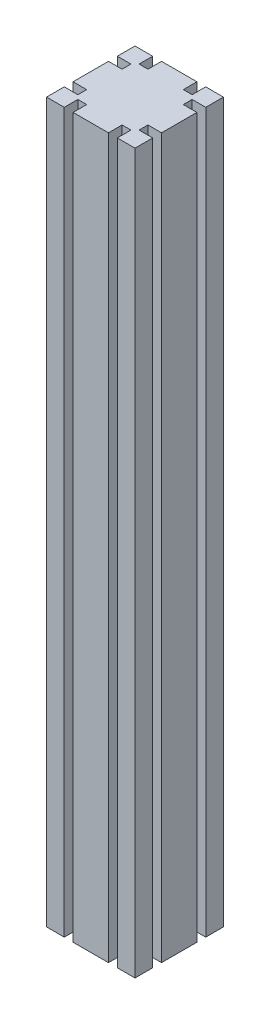
ISO-10303-21;
HEADER;
FILE_DESCRIPTION(('STEP AP214'),'2;1');
FILE_NAME('part.step','',(''),(''),'','','');
FILE_SCHEMA(('AUTOMOTIVE_DESIGN { 1 0 10303 214 1 1 1 1 }'));
ENDSEC;
DATA;
#1=APPLICATION_CONTEXT('core data for automotive mechanical design processes');
#2=APPLICATION_PROTOCOL_DEFINITION('international standard','automotive_design',2000,#1);
#3=PRODUCT_CONTEXT('',#1,'mechanical');
#4=PRODUCT('Part','Part','',(#3));
#5=PRODUCT_RELATED_PRODUCT_CATEGORY('part','',(#4));
#6=PRODUCT_DEFINITION_FORMATION('','',#4);
#7=PRODUCT_DEFINITION_CONTEXT('part definition',#1,'design');
#8=PRODUCT_DEFINITION('design','',#6,#7);
#9=PRODUCT_DEFINITION_SHAPE('','',#8);
#10=(LENGTH_UNIT() NAMED_UNIT(*) SI_UNIT(.MILLI.,.METRE.));
#11=(NAMED_UNIT(*) PLANE_ANGLE_UNIT() SI_UNIT($,.RADIAN.));
#12=(NAMED_UNIT(*) SI_UNIT($,.STERADIAN.) SOLID_ANGLE_UNIT());
#13=UNCERTAINTY_MEASURE_WITH_UNIT(LENGTH_MEASURE(1.E-05),#10,'distance_accuracy_value','');
#14=(GEOMETRIC_REPRESENTATION_CONTEXT(3) GLOBAL_UNCERTAINTY_ASSIGNED_CONTEXT((#13)) GLOBAL_UNIT_ASSIGNED_CONTEXT((#10,
#11,#12)) REPRESENTATION_CONTEXT('',''));
#15=CARTESIAN_POINT('',(0.,0.,0.));
#16=DIRECTION('',(0.,0.,1.));
#17=DIRECTION('',(1.,0.,0.));
#18=AXIS2_PLACEMENT_3D('',#15,#16,#17);
#19=CARTESIAN_POINT('',(-7.3207793932152,650.,0.));
#20=DIRECTION('',(-1.,0.,0.));
#21=DIRECTION('',(0.,0.,1.));
#22=AXIS2_PLACEMENT_3D('',#19,#20,#21);
#23=PLANE('',#22);
#24=DIRECTION('',(0.,0.,-1.));
#25=VECTOR('',#24,1.);
#26=CARTESIAN_POINT('',(-7.3207793932152,0.,0.));
#27=LINE('',#26,#25);
#28=CARTESIAN_POINT('',(-7.3207793932152,0.,-34.4799898452136));
#29=VERTEX_POINT('',#28);
#30=CARTESIAN_POINT('',(-7.3207793932152,0.,-50.4799898452136));
#31=VERTEX_POINT('',#30);
#32=EDGE_CURVE('E299',#29,#31,#27,.T.);
#33=ORIENTED_EDGE('',*,*,#32,.F.);
#34=DIRECTION('',(0.,-1.,0.));
#35=VECTOR('',#34,1.);
#36=CARTESIAN_POINT('',(-7.3207793932152,650.,-34.4799898452136));
#37=LINE('',#36,#35);
#38=CARTESIAN_POINT('',(-7.3207793932152,650.,-34.4799898452136));
#39=VERTEX_POINT('',#38);
#40=EDGE_CURVE('E11',#39,#29,#37,.T.);
#41=ORIENTED_EDGE('',*,*,#40,.F.);
#42=DIRECTION('',(0.,0.,-1.));
#43=VECTOR('',#42,1.);
#44=CARTESIAN_POINT('',(-7.3207793932152,650.,0.));
#45=LINE('',#44,#43);
#46=CARTESIAN_POINT('',(-7.3207793932152,650.,-50.4799898452136));
#47=VERTEX_POINT('',#46);
#48=EDGE_CURVE('E403',#39,#47,#45,.T.);
#49=ORIENTED_EDGE('',*,*,#48,.T.);
#50=DIRECTION('',(0.,-1.,0.));
#51=VECTOR('',#50,1.);
#52=CARTESIAN_POINT('',(-7.3207793932152,650.,-50.4799898452136));
#53=LINE('',#52,#51);
#54=EDGE_CURVE('E54',#47,#31,#53,.T.);
#55=ORIENTED_EDGE('',*,*,#54,.T.);
#56=EDGE_LOOP('',(#33,#41,#49,#55));
#57=FACE_BOUND('',#56,.T.);
#58=ADVANCED_FACE('F38',(#57),#23,.T.);
#59=CARTESIAN_POINT('',(0.,650.,-34.4799898452136));
#60=DIRECTION('',(0.,0.,1.));
#61=DIRECTION('',(1.,0.,0.));
#62=AXIS2_PLACEMENT_3D('',#59,#60,#61);
#63=PLANE('',#62);
#64=DIRECTION('',(-1.,0.,0.));
#65=VECTOR('',#64,1.);
#66=CARTESIAN_POINT('',(0.,0.,-34.4799898452136));
#67=LINE('',#66,#65);
#68=CARTESIAN_POINT('',(4.9792206067848,0.,-34.4799898452136));
#69=VERTEX_POINT('',#68);
#70=EDGE_CURVE('E301',#69,#29,#67,.T.);
#71=ORIENTED_EDGE('',*,*,#70,.F.);
#72=DIRECTION('',(0.,-1.,0.));
#73=VECTOR('',#72,1.);
#74=CARTESIAN_POINT('',(4.9792206067848,650.,-34.4799898452136));
#75=LINE('',#74,#73);
#76=CARTESIAN_POINT('',(4.9792206067848,650.,-34.4799898452136));
#77=VERTEX_POINT('',#76);
#78=EDGE_CURVE('E46',#77,#69,#75,.T.);
#79=ORIENTED_EDGE('',*,*,#78,.F.);
#80=DIRECTION('',(-1.,0.,0.));
#81=VECTOR('',#80,1.);
#82=CARTESIAN_POINT('',(0.,650.,-34.4799898452136));
#83=LINE('',#82,#81);
#84=EDGE_CURVE('E488',#77,#39,#83,.T.);
#85=ORIENTED_EDGE('',*,*,#84,.T.);
#86=ORIENTED_EDGE('',*,*,#40,.T.);
#87=EDGE_LOOP('',(#71,#79,#85,#86));
#88=FACE_BOUND('',#87,.T.);
#89=ADVANCED_FACE('F476',(#88),#63,.T.);
#90=CARTESIAN_POINT('',(4.9792206067848,650.,0.));
#91=DIRECTION('',(-1.,0.,0.));
#92=DIRECTION('',(0.,0.,1.));
#93=AXIS2_PLACEMENT_3D('',#90,#91,#92);
#94=PLANE('',#93);
#95=DIRECTION('',(0.,0.,-1.));
#96=VECTOR('',#95,1.);
#97=CARTESIAN_POINT('',(4.9792206067848,0.,0.));
#98=LINE('',#97,#96);
#99=CARTESIAN_POINT('',(4.9792206067848,0.,-26.4799898452136));
#100=VERTEX_POINT('',#99);
#101=EDGE_CURVE('E304',#100,#69,#98,.T.);
#102=ORIENTED_EDGE('',*,*,#101,.F.);
#103=DIRECTION('',(0.,-1.,0.));
#104=VECTOR('',#103,1.);
#105=CARTESIAN_POINT('',(4.9792206067848,650.,-26.4799898452136));
#106=LINE('',#105,#104);
#107=CARTESIAN_POINT('',(4.9792206067848,650.,-26.4799898452136));
#108=VERTEX_POINT('',#107);
#109=EDGE_CURVE('E465',#108,#100,#106,.T.);
#110=ORIENTED_EDGE('',*,*,#109,.F.);
#111=DIRECTION('',(0.,0.,-1.));
#112=VECTOR('',#111,1.);
#113=CARTESIAN_POINT('',(4.9792206067848,650.,0.));
#114=LINE('',#113,#112);
#115=EDGE_CURVE('E472',#108,#77,#114,.T.);
#116=ORIENTED_EDGE('',*,*,#115,.T.);
#117=ORIENTED_EDGE('',*,*,#78,.T.);
#118=EDGE_LOOP('',(#102,#110,#116,#117));
#119=FACE_BOUND('',#118,.T.);
#120=ADVANCED_FACE('F470',(#119),#94,.T.);
#121=CARTESIAN_POINT('',(0.,650.,-26.4799898452136));
#122=DIRECTION('',(0.,0.,-1.));
#123=DIRECTION('',(-1.,0.,0.));
#124=AXIS2_PLACEMENT_3D('',#121,#122,#123);
#125=PLANE('',#124);
#126=DIRECTION('',(1.,0.,0.));
#127=VECTOR('',#126,1.);
#128=CARTESIAN_POINT('',(0.,0.,-26.4799898452136));
#129=LINE('',#128,#127);
#130=CARTESIAN_POINT('',(-7.3207793932152,0.,-26.4799898452136));
#131=VERTEX_POINT('',#130);
#132=EDGE_CURVE('E307',#131,#100,#129,.T.);
#133=ORIENTED_EDGE('',*,*,#132,.F.);
#134=DIRECTION('',(0.,-1.,0.));
#135=VECTOR('',#134,1.);
#136=CARTESIAN_POINT('',(-7.3207793932152,650.,-26.4799898452136));
#137=LINE('',#136,#135);
#138=CARTESIAN_POINT('',(-7.3207793932152,650.,-26.4799898452136));
#139=VERTEX_POINT('',#138);
#140=EDGE_CURVE('E463',#139,#131,#137,.T.);
#141=ORIENTED_EDGE('',*,*,#140,.F.);
#142=DIRECTION('',(1.,0.,0.));
#143=VECTOR('',#142,1.);
#144=CARTESIAN_POINT('',(0.,650.,-26.4799898452136));
#145=LINE('',#144,#143);
#146=EDGE_CURVE('E485',#139,#108,#145,.T.);
#147=ORIENTED_EDGE('',*,*,#146,.T.);
#148=ORIENTED_EDGE('',*,*,#109,.T.);
#149=EDGE_LOOP('',(#133,#141,#147,#148));
#150=FACE_BOUND('',#149,.T.);
#151=ADVANCED_FACE('F482',(#150),#125,.T.);
#152=CARTESIAN_POINT('',(-7.3207793932152,650.,0.));
#153=DIRECTION('',(-1.,0.,0.));
#154=DIRECTION('',(0.,0.,1.));
#155=AXIS2_PLACEMENT_3D('',#152,#153,#154);
#156=PLANE('',#155);
#157=DIRECTION('',(0.,0.,-1.));
#158=VECTOR('',#157,1.);
#159=CARTESIAN_POINT('',(-7.3207793932152,0.,0.));
#160=LINE('',#159,#158);
#161=CARTESIAN_POINT('',(-7.3207793932152,0.,5.52001015478639));
#162=VERTEX_POINT('',#161);
#163=EDGE_CURVE('E310',#162,#131,#160,.T.);
#164=ORIENTED_EDGE('',*,*,#163,.F.);
#165=DIRECTION('',(0.,-1.,0.));
#166=VECTOR('',#165,1.);
#167=CARTESIAN_POINT('',(-7.3207793932152,650.,5.52001015478639));
#168=LINE('',#167,#166);
#169=CARTESIAN_POINT('',(-7.3207793932152,650.,5.52001015478639));
#170=VERTEX_POINT('',#169);
#171=EDGE_CURVE('E461',#170,#162,#168,.T.);
#172=ORIENTED_EDGE('',*,*,#171,.F.);
#173=DIRECTION('',(0.,0.,-1.));
#174=VECTOR('',#173,1.);
#175=CARTESIAN_POINT('',(-7.3207793932152,650.,0.));
#176=LINE('',#175,#174);
#177=EDGE_CURVE('E490',#170,#139,#176,.T.);
#178=ORIENTED_EDGE('',*,*,#177,.T.);
#179=ORIENTED_EDGE('',*,*,#140,.T.);
#180=EDGE_LOOP('',(#164,#172,#178,#179));
#181=FACE_BOUND('',#180,.T.);
#182=ADVANCED_FACE('F601',(#181),#156,.T.);
#183=CARTESIAN_POINT('',(0.,650.,5.52001015478639));
#184=DIRECTION('',(0.,0.,1.));
#185=DIRECTION('',(1.,0.,0.));
#186=AXIS2_PLACEMENT_3D('',#183,#184,#185);
#187=PLANE('',#186);
#188=DIRECTION('',(-1.,0.,0.));
#189=VECTOR('',#188,1.);
#190=CARTESIAN_POINT('',(0.,0.,5.52001015478639));
#191=LINE('',#190,#189);
#192=CARTESIAN_POINT('',(4.9792206067848,0.,5.52001015478639));
#193=VERTEX_POINT('',#192);
#194=EDGE_CURVE('E313',#193,#162,#191,.T.);
#195=ORIENTED_EDGE('',*,*,#194,.F.);
#196=DIRECTION('',(0.,-1.,0.));
#197=VECTOR('',#196,1.);
#198=CARTESIAN_POINT('',(4.9792206067848,650.,5.52001015478639));
#199=LINE('',#198,#197);
#200=CARTESIAN_POINT('',(4.9792206067848,650.,5.52001015478639));
#201=VERTEX_POINT('',#200);
#202=EDGE_CURVE('E459',#201,#193,#199,.T.);
#203=ORIENTED_EDGE('',*,*,#202,.F.);
#204=DIRECTION('',(-1.,0.,0.));
#205=VECTOR('',#204,1.);
#206=CARTESIAN_POINT('',(0.,650.,5.52001015478639));
#207=LINE('',#206,#205);
#208=EDGE_CURVE('E496',#201,#170,#207,.T.);
#209=ORIENTED_EDGE('',*,*,#208,.T.);
#210=ORIENTED_EDGE('',*,*,#171,.T.);
#211=EDGE_LOOP('',(#195,#203,#209,#210));
#212=FACE_BOUND('',#211,.T.);
#213=ADVANCED_FACE('F604',(#212),#187,.T.);
#214=CARTESIAN_POINT('',(4.9792206067848,650.,0.));
#215=DIRECTION('',(-1.,0.,0.));
#216=DIRECTION('',(0.,0.,1.));
#217=AXIS2_PLACEMENT_3D('',#214,#215,#216);
#218=PLANE('',#217);
#219=DIRECTION('',(0.,0.,-1.));
#220=VECTOR('',#219,1.);
#221=CARTESIAN_POINT('',(4.9792206067848,0.,0.));
#222=LINE('',#221,#220);
#223=CARTESIAN_POINT('',(4.9792206067848,0.,13.5200101547863));
#224=VERTEX_POINT('',#223);
#225=EDGE_CURVE('E316',#224,#193,#222,.T.);
#226=ORIENTED_EDGE('',*,*,#225,.F.);
#227=DIRECTION('',(0.,-1.,0.));
#228=VECTOR('',#227,1.);
#229=CARTESIAN_POINT('',(4.9792206067848,650.,13.5200101547863));
#230=LINE('',#229,#228);
#231=CARTESIAN_POINT('',(4.9792206067848,650.,13.5200101547863));
#232=VERTEX_POINT('',#231);
#233=EDGE_CURVE('E457',#232,#224,#230,.T.);
#234=ORIENTED_EDGE('',*,*,#233,.F.);
#235=DIRECTION('',(0.,0.,-1.));
#236=VECTOR('',#235,1.);
#237=CARTESIAN_POINT('',(4.9792206067848,650.,0.));
#238=LINE('',#237,#236);
#239=EDGE_CURVE('E499',#232,#201,#238,.T.);
#240=ORIENTED_EDGE('',*,*,#239,.T.);
#241=ORIENTED_EDGE('',*,*,#202,.T.);
#242=EDGE_LOOP('',(#226,#234,#240,#241));
#243=FACE_BOUND('',#242,.T.);
#244=ADVANCED_FACE('F608',(#243),#218,.T.);
#245=CARTESIAN_POINT('',(0.,650.,13.5200101547863));
#246=DIRECTION('',(0.,0.,-1.));
#247=DIRECTION('',(-1.,0.,0.));
#248=AXIS2_PLACEMENT_3D('',#245,#246,#247);
#249=PLANE('',#248);
#250=DIRECTION('',(1.,0.,0.));
#251=VECTOR('',#250,1.);
#252=CARTESIAN_POINT('',(0.,0.,13.5200101547863));
#253=LINE('',#252,#251);
#254=CARTESIAN_POINT('',(-7.32077939321523,0.,13.5200101547863));
#255=VERTEX_POINT('',#254);
#256=EDGE_CURVE('E319',#255,#224,#253,.T.);
#257=ORIENTED_EDGE('',*,*,#256,.F.);
#258=DIRECTION('',(0.,-1.,0.));
#259=VECTOR('',#258,1.);
#260=CARTESIAN_POINT('',(-7.32077939321523,650.,13.5200101547863));
#261=LINE('',#260,#259);
#262=CARTESIAN_POINT('',(-7.32077939321523,650.,13.5200101547863));
#263=VERTEX_POINT('',#262);
#264=EDGE_CURVE('E455',#263,#255,#261,.T.);
#265=ORIENTED_EDGE('',*,*,#264,.F.);
#266=DIRECTION('',(1.,0.,0.));
#267=VECTOR('',#266,1.);
#268=CARTESIAN_POINT('',(0.,650.,13.5200101547863));
#269=LINE('',#268,#267);
#270=EDGE_CURVE('E502',#263,#232,#269,.T.);
#271=ORIENTED_EDGE('',*,*,#270,.T.);
#272=ORIENTED_EDGE('',*,*,#233,.T.);
#273=EDGE_LOOP('',(#257,#265,#271,#272));
#274=FACE_BOUND('',#273,.T.);
#275=ADVANCED_FACE('F612',(#274),#249,.T.);
#276=CARTESIAN_POINT('',(-7.32077939321523,650.,0.));
#277=DIRECTION('',(-1.,0.,0.));
#278=DIRECTION('',(0.,0.,1.));
#279=AXIS2_PLACEMENT_3D('',#276,#277,#278);
#280=PLANE('',#279);
#281=DIRECTION('',(0.,0.,-1.));
#282=VECTOR('',#281,1.);
#283=CARTESIAN_POINT('',(-7.32077939321523,0.,0.));
#284=LINE('',#283,#282);
#285=CARTESIAN_POINT('',(-7.32077939321523,0.,29.5200101547863));
#286=VERTEX_POINT('',#285);
#287=EDGE_CURVE('E322',#286,#255,#284,.T.);
#288=ORIENTED_EDGE('',*,*,#287,.F.);
#289=DIRECTION('',(0.,-1.,0.));
#290=VECTOR('',#289,1.);
#291=CARTESIAN_POINT('',(-7.32077939321523,650.,29.5200101547863));
#292=LINE('',#291,#290);
#293=CARTESIAN_POINT('',(-7.32077939321523,650.,29.5200101547863));
#294=VERTEX_POINT('',#293);
#295=EDGE_CURVE('E453',#294,#286,#292,.T.);
#296=ORIENTED_EDGE('',*,*,#295,.F.);
#297=DIRECTION('',(0.,0.,-1.));
#298=VECTOR('',#297,1.);
#299=CARTESIAN_POINT('',(-7.32077939321523,650.,0.));
#300=LINE('',#299,#298);
#301=EDGE_CURVE('E505',#294,#263,#300,.T.);
#302=ORIENTED_EDGE('',*,*,#301,.T.);
#303=ORIENTED_EDGE('',*,*,#264,.T.);
#304=EDGE_LOOP('',(#288,#296,#302,#303));
#305=FACE_BOUND('',#304,.T.);
#306=ADVANCED_FACE('F616',(#305),#280,.T.);
#307=CARTESIAN_POINT('',(0.,650.,29.5200101547863));
#308=DIRECTION('',(0.,0.,1.));
#309=DIRECTION('',(1.,0.,0.));
#310=AXIS2_PLACEMENT_3D('',#307,#308,#309);
#311=PLANE('',#310);
#312=DIRECTION('',(-1.,0.,0.));
#313=VECTOR('',#312,1.);
#314=CARTESIAN_POINT('',(0.,0.,29.5200101547863));
#315=LINE('',#314,#313);
#316=CARTESIAN_POINT('',(8.67922060678477,0.,29.5200101547863));
#317=VERTEX_POINT('',#316);
#318=EDGE_CURVE('E325',#317,#286,#315,.T.);
#319=ORIENTED_EDGE('',*,*,#318,.F.);
#320=DIRECTION('',(0.,-1.,0.));
#321=VECTOR('',#320,1.);
#322=CARTESIAN_POINT('',(8.67922060678477,650.,29.5200101547863));
#323=LINE('',#322,#321);
#324=CARTESIAN_POINT('',(8.67922060678477,650.,29.5200101547863));
#325=VERTEX_POINT('',#324);
#326=EDGE_CURVE('E451',#325,#317,#323,.T.);
#327=ORIENTED_EDGE('',*,*,#326,.F.);
#328=DIRECTION('',(-1.,0.,0.));
#329=VECTOR('',#328,1.);
#330=CARTESIAN_POINT('',(0.,650.,29.5200101547863));
#331=LINE('',#330,#329);
#332=EDGE_CURVE('E508',#325,#294,#331,.T.);
#333=ORIENTED_EDGE('',*,*,#332,.T.);
#334=ORIENTED_EDGE('',*,*,#295,.T.);
#335=EDGE_LOOP('',(#319,#327,#333,#334));
#336=FACE_BOUND('',#335,.T.);
#337=ADVANCED_FACE('F620',(#336),#311,.T.);
#338=CARTESIAN_POINT('',(8.67922060678478,650.,0.));
#339=DIRECTION('',(1.,0.,0.));
#340=DIRECTION('',(0.,0.,-1.));
#341=AXIS2_PLACEMENT_3D('',#338,#339,#340);
#342=PLANE('',#341);
#343=DIRECTION('',(0.,0.,1.));
#344=VECTOR('',#343,1.);
#345=CARTESIAN_POINT('',(8.67922060678478,0.,0.));
#346=LINE('',#345,#344);
#347=CARTESIAN_POINT('',(8.67922060678478,0.,17.2200101547863));
#348=VERTEX_POINT('',#347);
#349=EDGE_CURVE('E328',#348,#317,#346,.T.);
#350=ORIENTED_EDGE('',*,*,#349,.F.);
#351=DIRECTION('',(0.,-1.,0.));
#352=VECTOR('',#351,1.);
#353=CARTESIAN_POINT('',(8.67922060678478,650.,17.2200101547863));
#354=LINE('',#353,#352);
#355=CARTESIAN_POINT('',(8.67922060678478,650.,17.2200101547863));
#356=VERTEX_POINT('',#355);
#357=EDGE_CURVE('E449',#356,#348,#354,.T.);
#358=ORIENTED_EDGE('',*,*,#357,.F.);
#359=DIRECTION('',(0.,0.,1.));
#360=VECTOR('',#359,1.);
#361=CARTESIAN_POINT('',(8.67922060678478,650.,0.));
#362=LINE('',#361,#360);
#363=EDGE_CURVE('E511',#356,#325,#362,.T.);
#364=ORIENTED_EDGE('',*,*,#363,.T.);
#365=ORIENTED_EDGE('',*,*,#326,.T.);
#366=EDGE_LOOP('',(#350,#358,#364,#365));
#367=FACE_BOUND('',#366,.T.);
#368=ADVANCED_FACE('F624',(#367),#342,.T.);
#369=CARTESIAN_POINT('',(0.,650.,17.2200101547863));
#370=DIRECTION('',(0.,0.,1.));
#371=DIRECTION('',(1.,0.,0.));
#372=AXIS2_PLACEMENT_3D('',#369,#370,#371);
#373=PLANE('',#372);
#374=DIRECTION('',(-1.,0.,0.));
#375=VECTOR('',#374,1.);
#376=CARTESIAN_POINT('',(0.,0.,17.2200101547863));
#377=LINE('',#376,#375);
#378=CARTESIAN_POINT('',(16.6792206067848,0.,17.2200101547863));
#379=VERTEX_POINT('',#378);
#380=EDGE_CURVE('E331',#379,#348,#377,.T.);
#381=ORIENTED_EDGE('',*,*,#380,.F.);
#382=DIRECTION('',(0.,-1.,0.));
#383=VECTOR('',#382,1.);
#384=CARTESIAN_POINT('',(16.6792206067848,650.,17.2200101547863));
#385=LINE('',#384,#383);
#386=CARTESIAN_POINT('',(16.6792206067848,650.,17.2200101547863));
#387=VERTEX_POINT('',#386);
#388=EDGE_CURVE('E447',#387,#379,#385,.T.);
#389=ORIENTED_EDGE('',*,*,#388,.F.);
#390=DIRECTION('',(-1.,0.,0.));
#391=VECTOR('',#390,1.);
#392=CARTESIAN_POINT('',(0.,650.,17.2200101547863));
#393=LINE('',#392,#391);
#394=EDGE_CURVE('E514',#387,#356,#393,.T.);
#395=ORIENTED_EDGE('',*,*,#394,.T.);
#396=ORIENTED_EDGE('',*,*,#357,.T.);
#397=EDGE_LOOP('',(#381,#389,#395,#396));
#398=FACE_BOUND('',#397,.T.);
#399=ADVANCED_FACE('F628',(#398),#373,.T.);
#400=CARTESIAN_POINT('',(16.6792206067848,650.,0.));
#401=DIRECTION('',(-1.,0.,0.));
#402=DIRECTION('',(0.,0.,1.));
#403=AXIS2_PLACEMENT_3D('',#400,#401,#402);
#404=PLANE('',#403);
#405=DIRECTION('',(0.,0.,-1.));
#406=VECTOR('',#405,1.);
#407=CARTESIAN_POINT('',(16.6792206067848,0.,0.));
#408=LINE('',#407,#406);
#409=CARTESIAN_POINT('',(16.6792206067848,0.,29.5200101547863));
#410=VERTEX_POINT('',#409);
#411=EDGE_CURVE('E334',#410,#379,#408,.T.);
#412=ORIENTED_EDGE('',*,*,#411,.F.);
#413=DIRECTION('',(0.,-1.,0.));
#414=VECTOR('',#413,1.);
#415=CARTESIAN_POINT('',(16.6792206067848,650.,29.5200101547863));
#416=LINE('',#415,#414);
#417=CARTESIAN_POINT('',(16.6792206067848,650.,29.5200101547863));
#418=VERTEX_POINT('',#417);
#419=EDGE_CURVE('E445',#418,#410,#416,.T.);
#420=ORIENTED_EDGE('',*,*,#419,.F.);
#421=DIRECTION('',(0.,0.,-1.));
#422=VECTOR('',#421,1.);
#423=CARTESIAN_POINT('',(16.6792206067848,650.,0.));
#424=LINE('',#423,#422);
#425=EDGE_CURVE('E517',#418,#387,#424,.T.);
#426=ORIENTED_EDGE('',*,*,#425,.T.);
#427=ORIENTED_EDGE('',*,*,#388,.T.);
#428=EDGE_LOOP('',(#412,#420,#426,#427));
#429=FACE_BOUND('',#428,.T.);
#430=ADVANCED_FACE('F632',(#429),#404,.T.);
#431=CARTESIAN_POINT('',(0.,650.,29.5200101547863));
#432=DIRECTION('',(0.,0.,1.));
#433=DIRECTION('',(1.,0.,0.));
#434=AXIS2_PLACEMENT_3D('',#431,#432,#433);
#435=PLANE('',#434);
#436=DIRECTION('',(-1.,0.,0.));
#437=VECTOR('',#436,1.);
#438=CARTESIAN_POINT('',(0.,0.,29.5200101547863));
#439=LINE('',#438,#437);
#440=CARTESIAN_POINT('',(48.6792206067848,0.,29.5200101547863));
#441=VERTEX_POINT('',#440);
#442=EDGE_CURVE('E337',#441,#410,#439,.T.);
#443=ORIENTED_EDGE('',*,*,#442,.F.);
#444=DIRECTION('',(0.,-1.,0.));
#445=VECTOR('',#444,1.);
#446=CARTESIAN_POINT('',(48.6792206067848,650.,29.5200101547863));
#447=LINE('',#446,#445);
#448=CARTESIAN_POINT('',(48.6792206067848,650.,29.5200101547863));
#449=VERTEX_POINT('',#448);
#450=EDGE_CURVE('E443',#449,#441,#447,.T.);
#451=ORIENTED_EDGE('',*,*,#450,.F.);
#452=DIRECTION('',(-1.,0.,0.));
#453=VECTOR('',#452,1.);
#454=CARTESIAN_POINT('',(0.,650.,29.5200101547863));
#455=LINE('',#454,#453);
#456=EDGE_CURVE('E520',#449,#418,#455,.T.);
#457=ORIENTED_EDGE('',*,*,#456,.T.);
#458=ORIENTED_EDGE('',*,*,#419,.T.);
#459=EDGE_LOOP('',(#443,#451,#457,#458));
#460=FACE_BOUND('',#459,.T.);
#461=ADVANCED_FACE('F636',(#460),#435,.T.);
#462=CARTESIAN_POINT('',(48.6792206067847,650.,-2.19694274546584E-13));
#463=DIRECTION('',(1.,0.,0.));
#464=DIRECTION('',(0.,0.,-1.));
#465=AXIS2_PLACEMENT_3D('',#462,#463,#464);
#466=PLANE('',#465);
#467=DIRECTION('',(0.,0.,1.));
#468=VECTOR('',#467,1.);
#469=CARTESIAN_POINT('',(48.6792206067847,0.,-2.19694274546584E-13));
#470=LINE('',#469,#468);
#471=CARTESIAN_POINT('',(48.6792206067848,0.,17.2200101547863));
#472=VERTEX_POINT('',#471);
#473=EDGE_CURVE('E340',#472,#441,#470,.T.);
#474=ORIENTED_EDGE('',*,*,#473,.F.);
#475=DIRECTION('',(0.,-1.,0.));
#476=VECTOR('',#475,1.);
#477=CARTESIAN_POINT('',(48.6792206067848,650.,17.2200101547863));
#478=LINE('',#477,#476);
#479=CARTESIAN_POINT('',(48.6792206067848,650.,17.2200101547863));
#480=VERTEX_POINT('',#479);
#481=EDGE_CURVE('E441',#480,#472,#478,.T.);
#482=ORIENTED_EDGE('',*,*,#481,.F.);
#483=DIRECTION('',(0.,0.,1.));
#484=VECTOR('',#483,1.);
#485=CARTESIAN_POINT('',(48.6792206067847,650.,-2.19694274546584E-13));
#486=LINE('',#485,#484);
#487=EDGE_CURVE('E523',#480,#449,#486,.T.);
#488=ORIENTED_EDGE('',*,*,#487,.T.);
#489=ORIENTED_EDGE('',*,*,#450,.T.);
#490=EDGE_LOOP('',(#474,#482,#488,#489));
#491=FACE_BOUND('',#490,.T.);
#492=ADVANCED_FACE('F640',(#491),#466,.T.);
#493=CARTESIAN_POINT('',(0.,650.,17.2200101547863));
#494=DIRECTION('',(0.,0.,1.));
#495=DIRECTION('',(1.,0.,0.));
#496=AXIS2_PLACEMENT_3D('',#493,#494,#495);
#497=PLANE('',#496);
#498=DIRECTION('',(-1.,0.,0.));
#499=VECTOR('',#498,1.);
#500=CARTESIAN_POINT('',(0.,0.,17.2200101547863));
#501=LINE('',#500,#499);
#502=CARTESIAN_POINT('',(56.6792206067848,0.,17.2200101547863));
#503=VERTEX_POINT('',#502);
#504=EDGE_CURVE('E343',#503,#472,#501,.T.);
#505=ORIENTED_EDGE('',*,*,#504,.F.);
#506=DIRECTION('',(0.,-1.,0.));
#507=VECTOR('',#506,1.);
#508=CARTESIAN_POINT('',(56.6792206067848,650.,17.2200101547863));
#509=LINE('',#508,#507);
#510=CARTESIAN_POINT('',(56.6792206067848,650.,17.2200101547863));
#511=VERTEX_POINT('',#510);
#512=EDGE_CURVE('E439',#511,#503,#509,.T.);
#513=ORIENTED_EDGE('',*,*,#512,.F.);
#514=DIRECTION('',(-1.,0.,0.));
#515=VECTOR('',#514,1.);
#516=CARTESIAN_POINT('',(0.,650.,17.2200101547863));
#517=LINE('',#516,#515);
#518=EDGE_CURVE('E526',#511,#480,#517,.T.);
#519=ORIENTED_EDGE('',*,*,#518,.T.);
#520=ORIENTED_EDGE('',*,*,#481,.T.);
#521=EDGE_LOOP('',(#505,#513,#519,#520));
#522=FACE_BOUND('',#521,.T.);
#523=ADVANCED_FACE('F644',(#522),#497,.T.);
#524=CARTESIAN_POINT('',(56.6792206067847,650.,-1.91849316266649E-13));
#525=DIRECTION('',(-1.,0.,0.));
#526=DIRECTION('',(0.,0.,1.));
#527=AXIS2_PLACEMENT_3D('',#524,#525,#526);
#528=PLANE('',#527);
#529=DIRECTION('',(0.,0.,-1.));
#530=VECTOR('',#529,1.);
#531=CARTESIAN_POINT('',(56.6792206067847,0.,-1.91849316266649E-13));
#532=LINE('',#531,#530);
#533=CARTESIAN_POINT('',(56.6792206067848,0.,29.5200101547863));
#534=VERTEX_POINT('',#533);
#535=EDGE_CURVE('E346',#534,#503,#532,.T.);
#536=ORIENTED_EDGE('',*,*,#535,.F.);
#537=DIRECTION('',(0.,-1.,0.));
#538=VECTOR('',#537,1.);
#539=CARTESIAN_POINT('',(56.6792206067848,650.,29.5200101547863));
#540=LINE('',#539,#538);
#541=CARTESIAN_POINT('',(56.6792206067848,650.,29.5200101547863));
#542=VERTEX_POINT('',#541);
#543=EDGE_CURVE('E437',#542,#534,#540,.T.);
#544=ORIENTED_EDGE('',*,*,#543,.F.);
#545=DIRECTION('',(0.,0.,-1.));
#546=VECTOR('',#545,1.);
#547=CARTESIAN_POINT('',(56.6792206067847,650.,-1.91849316266649E-13));
#548=LINE('',#547,#546);
#549=EDGE_CURVE('E529',#542,#511,#548,.T.);
#550=ORIENTED_EDGE('',*,*,#549,.T.);
#551=ORIENTED_EDGE('',*,*,#512,.T.);
#552=EDGE_LOOP('',(#536,#544,#550,#551));
#553=FACE_BOUND('',#552,.T.);
#554=ADVANCED_FACE('F648',(#553),#528,.T.);
#555=CARTESIAN_POINT('',(0.,650.,29.5200101547863));
#556=DIRECTION('',(0.,0.,1.));
#557=DIRECTION('',(1.,0.,0.));
#558=AXIS2_PLACEMENT_3D('',#555,#556,#557);
#559=PLANE('',#558);
#560=DIRECTION('',(-1.,0.,0.));
#561=VECTOR('',#560,1.);
#562=CARTESIAN_POINT('',(0.,0.,29.5200101547863));
#563=LINE('',#562,#561);
#564=CARTESIAN_POINT('',(72.6792206067848,0.,29.5200101547863));
#565=VERTEX_POINT('',#564);
#566=EDGE_CURVE('E349',#565,#534,#563,.T.);
#567=ORIENTED_EDGE('',*,*,#566,.F.);
#568=DIRECTION('',(0.,-1.,0.));
#569=VECTOR('',#568,1.);
#570=CARTESIAN_POINT('',(72.6792206067848,650.,29.5200101547863));
#571=LINE('',#570,#569);
#572=CARTESIAN_POINT('',(72.6792206067848,650.,29.5200101547863));
#573=VERTEX_POINT('',#572);
#574=EDGE_CURVE('E435',#573,#565,#571,.T.);
#575=ORIENTED_EDGE('',*,*,#574,.F.);
#576=DIRECTION('',(-1.,0.,0.));
#577=VECTOR('',#576,1.);
#578=CARTESIAN_POINT('',(0.,650.,29.5200101547863));
#579=LINE('',#578,#577);
#580=EDGE_CURVE('E532',#573,#542,#579,.T.);
#581=ORIENTED_EDGE('',*,*,#580,.T.);
#582=ORIENTED_EDGE('',*,*,#543,.T.);
#583=EDGE_LOOP('',(#567,#575,#581,#582));
#584=FACE_BOUND('',#583,.T.);
#585=ADVANCED_FACE('F652',(#584),#559,.T.);
#586=CARTESIAN_POINT('',(72.6792206067848,650.,0.));
#587=DIRECTION('',(1.,0.,0.));
#588=DIRECTION('',(0.,0.,-1.));
#589=AXIS2_PLACEMENT_3D('',#586,#587,#588);
#590=PLANE('',#589);
#591=DIRECTION('',(0.,0.,1.));
#592=VECTOR('',#591,1.);
#593=CARTESIAN_POINT('',(72.6792206067848,0.,0.));
#594=LINE('',#593,#592);
#595=CARTESIAN_POINT('',(72.6792206067848,0.,13.5200101547864));
#596=VERTEX_POINT('',#595);
#597=EDGE_CURVE('E352',#596,#565,#594,.T.);
#598=ORIENTED_EDGE('',*,*,#597,.F.);
#599=DIRECTION('',(0.,-1.,0.));
#600=VECTOR('',#599,1.);
#601=CARTESIAN_POINT('',(72.6792206067848,650.,13.5200101547864));
#602=LINE('',#601,#600);
#603=CARTESIAN_POINT('',(72.6792206067848,650.,13.5200101547864));
#604=VERTEX_POINT('',#603);
#605=EDGE_CURVE('E433',#604,#596,#602,.T.);
#606=ORIENTED_EDGE('',*,*,#605,.F.);
#607=DIRECTION('',(0.,0.,1.));
#608=VECTOR('',#607,1.);
#609=CARTESIAN_POINT('',(72.6792206067848,650.,0.));
#610=LINE('',#609,#608);
#611=EDGE_CURVE('E535',#604,#573,#610,.T.);
#612=ORIENTED_EDGE('',*,*,#611,.T.);
#613=ORIENTED_EDGE('',*,*,#574,.T.);
#614=EDGE_LOOP('',(#598,#606,#612,#613));
#615=FACE_BOUND('',#614,.T.);
#616=ADVANCED_FACE('F656',(#615),#590,.T.);
#617=CARTESIAN_POINT('',(0.,650.,13.5200101547864));
#618=DIRECTION('',(0.,0.,-1.));
#619=DIRECTION('',(-1.,0.,0.));
#620=AXIS2_PLACEMENT_3D('',#617,#618,#619);
#621=PLANE('',#620);
#622=DIRECTION('',(1.,0.,0.));
#623=VECTOR('',#622,1.);
#624=CARTESIAN_POINT('',(0.,0.,13.5200101547864));
#625=LINE('',#624,#623);
#626=CARTESIAN_POINT('',(60.3792206067848,0.,13.5200101547864));
#627=VERTEX_POINT('',#626);
#628=EDGE_CURVE('E355',#627,#596,#625,.T.);
#629=ORIENTED_EDGE('',*,*,#628,.F.);
#630=DIRECTION('',(0.,-1.,0.));
#631=VECTOR('',#630,1.);
#632=CARTESIAN_POINT('',(60.3792206067848,650.,13.5200101547864));
#633=LINE('',#632,#631);
#634=CARTESIAN_POINT('',(60.3792206067848,650.,13.5200101547864));
#635=VERTEX_POINT('',#634);
#636=EDGE_CURVE('E431',#635,#627,#633,.T.);
#637=ORIENTED_EDGE('',*,*,#636,.F.);
#638=DIRECTION('',(1.,0.,0.));
#639=VECTOR('',#638,1.);
#640=CARTESIAN_POINT('',(0.,650.,13.5200101547864));
#641=LINE('',#640,#639);
#642=EDGE_CURVE('E538',#635,#604,#641,.T.);
#643=ORIENTED_EDGE('',*,*,#642,.T.);
#644=ORIENTED_EDGE('',*,*,#605,.T.);
#645=EDGE_LOOP('',(#629,#637,#643,#644));
#646=FACE_BOUND('',#645,.T.);
#647=ADVANCED_FACE('F660',(#646),#621,.T.);
#648=CARTESIAN_POINT('',(60.3792206067848,650.,0.));
#649=DIRECTION('',(1.,0.,0.));
#650=DIRECTION('',(0.,0.,-1.));
#651=AXIS2_PLACEMENT_3D('',#648,#649,#650);
#652=PLANE('',#651);
#653=DIRECTION('',(0.,0.,1.));
#654=VECTOR('',#653,1.);
#655=CARTESIAN_POINT('',(60.3792206067848,0.,0.));
#656=LINE('',#655,#654);
#657=CARTESIAN_POINT('',(60.3792206067848,0.,5.5200101547864));
#658=VERTEX_POINT('',#657);
#659=EDGE_CURVE('E358',#658,#627,#656,.T.);
#660=ORIENTED_EDGE('',*,*,#659,.F.);
#661=DIRECTION('',(0.,-1.,0.));
#662=VECTOR('',#661,1.);
#663=CARTESIAN_POINT('',(60.3792206067848,650.,5.5200101547864));
#664=LINE('',#663,#662);
#665=CARTESIAN_POINT('',(60.3792206067848,650.,5.5200101547864));
#666=VERTEX_POINT('',#665);
#667=EDGE_CURVE('E429',#666,#658,#664,.T.);
#668=ORIENTED_EDGE('',*,*,#667,.F.);
#669=DIRECTION('',(0.,0.,1.));
#670=VECTOR('',#669,1.);
#671=CARTESIAN_POINT('',(60.3792206067848,650.,0.));
#672=LINE('',#671,#670);
#673=EDGE_CURVE('E541',#666,#635,#672,.T.);
#674=ORIENTED_EDGE('',*,*,#673,.T.);
#675=ORIENTED_EDGE('',*,*,#636,.T.);
#676=EDGE_LOOP('',(#660,#668,#674,#675));
#677=FACE_BOUND('',#676,.T.);
#678=ADVANCED_FACE('F664',(#677),#652,.T.);
#679=CARTESIAN_POINT('',(0.,650.,5.52001015478642));
#680=DIRECTION('',(0.,0.,1.));
#681=DIRECTION('',(1.,0.,0.));
#682=AXIS2_PLACEMENT_3D('',#679,#680,#681);
#683=PLANE('',#682);
#684=DIRECTION('',(-1.,0.,0.));
#685=VECTOR('',#684,1.);
#686=CARTESIAN_POINT('',(0.,0.,5.52001015478642));
#687=LINE('',#686,#685);
#688=CARTESIAN_POINT('',(72.6792206067848,0.,5.52001015478639));
#689=VERTEX_POINT('',#688);
#690=EDGE_CURVE('E361',#689,#658,#687,.T.);
#691=ORIENTED_EDGE('',*,*,#690,.F.);
#692=DIRECTION('',(0.,-1.,0.));
#693=VECTOR('',#692,1.);
#694=CARTESIAN_POINT('',(72.6792206067848,650.,5.52001015478639));
#695=LINE('',#694,#693);
#696=CARTESIAN_POINT('',(72.6792206067848,650.,5.52001015478639));
#697=VERTEX_POINT('',#696);
#698=EDGE_CURVE('E427',#697,#689,#695,.T.);
#699=ORIENTED_EDGE('',*,*,#698,.F.);
#700=DIRECTION('',(-1.,0.,0.));
#701=VECTOR('',#700,1.);
#702=CARTESIAN_POINT('',(0.,650.,5.52001015478642));
#703=LINE('',#702,#701);
#704=EDGE_CURVE('E544',#697,#666,#703,.T.);
#705=ORIENTED_EDGE('',*,*,#704,.T.);
#706=ORIENTED_EDGE('',*,*,#667,.T.);
#707=EDGE_LOOP('',(#691,#699,#705,#706));
#708=FACE_BOUND('',#707,.T.);
#709=ADVANCED_FACE('F668',(#708),#683,.T.);
#710=CARTESIAN_POINT('',(72.6792206067848,650.,0.));
#711=DIRECTION('',(1.,0.,0.));
#712=DIRECTION('',(0.,0.,-1.));
#713=AXIS2_PLACEMENT_3D('',#710,#711,#712);
#714=PLANE('',#713);
#715=DIRECTION('',(0.,0.,1.));
#716=VECTOR('',#715,1.);
#717=CARTESIAN_POINT('',(72.6792206067848,0.,0.));
#718=LINE('',#717,#716);
#719=CARTESIAN_POINT('',(72.6792206067848,0.,-26.4799898452136));
#720=VERTEX_POINT('',#719);
#721=EDGE_CURVE('E364',#720,#689,#718,.T.);
#722=ORIENTED_EDGE('',*,*,#721,.F.);
#723=DIRECTION('',(0.,-1.,0.));
#724=VECTOR('',#723,1.);
#725=CARTESIAN_POINT('',(72.6792206067848,650.,-26.4799898452136));
#726=LINE('',#725,#724);
#727=CARTESIAN_POINT('',(72.6792206067848,650.,-26.4799898452136));
#728=VERTEX_POINT('',#727);
#729=EDGE_CURVE('E425',#728,#720,#726,.T.);
#730=ORIENTED_EDGE('',*,*,#729,.F.);
#731=DIRECTION('',(0.,0.,1.));
#732=VECTOR('',#731,1.);
#733=CARTESIAN_POINT('',(72.6792206067848,650.,0.));
#734=LINE('',#733,#732);
#735=EDGE_CURVE('E547',#728,#697,#734,.T.);
#736=ORIENTED_EDGE('',*,*,#735,.T.);
#737=ORIENTED_EDGE('',*,*,#698,.T.);
#738=EDGE_LOOP('',(#722,#730,#736,#737));
#739=FACE_BOUND('',#738,.T.);
#740=ADVANCED_FACE('F672',(#739),#714,.T.);
#741=CARTESIAN_POINT('',(0.,650.,-26.4799898452136));
#742=DIRECTION('',(0.,0.,-1.));
#743=DIRECTION('',(-1.,0.,0.));
#744=AXIS2_PLACEMENT_3D('',#741,#742,#743);
#745=PLANE('',#744);
#746=DIRECTION('',(1.,0.,0.));
#747=VECTOR('',#746,1.);
#748=CARTESIAN_POINT('',(0.,0.,-26.4799898452136));
#749=LINE('',#748,#747);
#750=CARTESIAN_POINT('',(60.3792206067848,0.,-26.4799898452136));
#751=VERTEX_POINT('',#750);
#752=EDGE_CURVE('E367',#751,#720,#749,.T.);
#753=ORIENTED_EDGE('',*,*,#752,.F.);
#754=DIRECTION('',(0.,-1.,0.));
#755=VECTOR('',#754,1.);
#756=CARTESIAN_POINT('',(60.3792206067848,650.,-26.4799898452136));
#757=LINE('',#756,#755);
#758=CARTESIAN_POINT('',(60.3792206067848,650.,-26.4799898452136));
#759=VERTEX_POINT('',#758);
#760=EDGE_CURVE('E423',#759,#751,#757,.T.);
#761=ORIENTED_EDGE('',*,*,#760,.F.);
#762=DIRECTION('',(1.,0.,0.));
#763=VECTOR('',#762,1.);
#764=CARTESIAN_POINT('',(0.,650.,-26.4799898452136));
#765=LINE('',#764,#763);
#766=EDGE_CURVE('E550',#759,#728,#765,.T.);
#767=ORIENTED_EDGE('',*,*,#766,.T.);
#768=ORIENTED_EDGE('',*,*,#729,.T.);
#769=EDGE_LOOP('',(#753,#761,#767,#768));
#770=FACE_BOUND('',#769,.T.);
#771=ADVANCED_FACE('F676',(#770),#745,.T.);
#772=CARTESIAN_POINT('',(60.3792206067848,650.,0.));
#773=DIRECTION('',(1.,0.,0.));
#774=DIRECTION('',(0.,0.,-1.));
#775=AXIS2_PLACEMENT_3D('',#772,#773,#774);
#776=PLANE('',#775);
#777=DIRECTION('',(0.,0.,1.));
#778=VECTOR('',#777,1.);
#779=CARTESIAN_POINT('',(60.3792206067848,0.,0.));
#780=LINE('',#779,#778);
#781=CARTESIAN_POINT('',(60.3792206067848,0.,-34.4799898452136));
#782=VERTEX_POINT('',#781);
#783=EDGE_CURVE('E370',#782,#751,#780,.T.);
#784=ORIENTED_EDGE('',*,*,#783,.F.);
#785=DIRECTION('',(0.,-1.,0.));
#786=VECTOR('',#785,1.);
#787=CARTESIAN_POINT('',(60.3792206067848,650.,-34.4799898452136));
#788=LINE('',#787,#786);
#789=CARTESIAN_POINT('',(60.3792206067848,650.,-34.4799898452136));
#790=VERTEX_POINT('',#789);
#791=EDGE_CURVE('E421',#790,#782,#788,.T.);
#792=ORIENTED_EDGE('',*,*,#791,.F.);
#793=DIRECTION('',(0.,0.,1.));
#794=VECTOR('',#793,1.);
#795=CARTESIAN_POINT('',(60.3792206067848,650.,0.));
#796=LINE('',#795,#794);
#797=EDGE_CURVE('E553',#790,#759,#796,.T.);
#798=ORIENTED_EDGE('',*,*,#797,.T.);
#799=ORIENTED_EDGE('',*,*,#760,.T.);
#800=EDGE_LOOP('',(#784,#792,#798,#799));
#801=FACE_BOUND('',#800,.T.);
#802=ADVANCED_FACE('F680',(#801),#776,.T.);
#803=CARTESIAN_POINT('',(0.,650.,-34.4799898452136));
#804=DIRECTION('',(0.,0.,1.));
#805=DIRECTION('',(1.,0.,0.));
#806=AXIS2_PLACEMENT_3D('',#803,#804,#805);
#807=PLANE('',#806);
#808=DIRECTION('',(-1.,0.,0.));
#809=VECTOR('',#808,1.);
#810=CARTESIAN_POINT('',(0.,0.,-34.4799898452136));
#811=LINE('',#810,#809);
#812=CARTESIAN_POINT('',(72.6792206067848,0.,-34.4799898452136));
#813=VERTEX_POINT('',#812);
#814=EDGE_CURVE('E373',#813,#782,#811,.T.);
#815=ORIENTED_EDGE('',*,*,#814,.F.);
#816=DIRECTION('',(0.,-1.,0.));
#817=VECTOR('',#816,1.);
#818=CARTESIAN_POINT('',(72.6792206067848,650.,-34.4799898452136));
#819=LINE('',#818,#817);
#820=CARTESIAN_POINT('',(72.6792206067848,650.,-34.4799898452136));
#821=VERTEX_POINT('',#820);
#822=EDGE_CURVE('E419',#821,#813,#819,.T.);
#823=ORIENTED_EDGE('',*,*,#822,.F.);
#824=DIRECTION('',(-1.,0.,0.));
#825=VECTOR('',#824,1.);
#826=CARTESIAN_POINT('',(0.,650.,-34.4799898452136));
#827=LINE('',#826,#825);
#828=EDGE_CURVE('E556',#821,#790,#827,.T.);
#829=ORIENTED_EDGE('',*,*,#828,.T.);
#830=ORIENTED_EDGE('',*,*,#791,.T.);
#831=EDGE_LOOP('',(#815,#823,#829,#830));
#832=FACE_BOUND('',#831,.T.);
#833=ADVANCED_FACE('F684',(#832),#807,.T.);
#834=CARTESIAN_POINT('',(72.6792206067848,650.,0.));
#835=DIRECTION('',(1.,0.,0.));
#836=DIRECTION('',(0.,0.,-1.));
#837=AXIS2_PLACEMENT_3D('',#834,#835,#836);
#838=PLANE('',#837);
#839=DIRECTION('',(0.,0.,1.));
#840=VECTOR('',#839,1.);
#841=CARTESIAN_POINT('',(72.6792206067848,0.,0.));
#842=LINE('',#841,#840);
#843=CARTESIAN_POINT('',(72.6792206067848,0.,-50.4799898452136));
#844=VERTEX_POINT('',#843);
#845=EDGE_CURVE('E376',#844,#813,#842,.T.);
#846=ORIENTED_EDGE('',*,*,#845,.F.);
#847=DIRECTION('',(0.,-1.,0.));
#848=VECTOR('',#847,1.);
#849=CARTESIAN_POINT('',(72.6792206067848,650.,-50.4799898452136));
#850=LINE('',#849,#848);
#851=CARTESIAN_POINT('',(72.6792206067848,650.,-50.4799898452136));
#852=VERTEX_POINT('',#851);
#853=EDGE_CURVE('E417',#852,#844,#850,.T.);
#854=ORIENTED_EDGE('',*,*,#853,.F.);
#855=DIRECTION('',(0.,0.,1.));
#856=VECTOR('',#855,1.);
#857=CARTESIAN_POINT('',(72.6792206067848,650.,0.));
#858=LINE('',#857,#856);
#859=EDGE_CURVE('E559',#852,#821,#858,.T.);
#860=ORIENTED_EDGE('',*,*,#859,.T.);
#861=ORIENTED_EDGE('',*,*,#822,.T.);
#862=EDGE_LOOP('',(#846,#854,#860,#861));
#863=FACE_BOUND('',#862,.T.);
#864=ADVANCED_FACE('F688',(#863),#838,.T.);
#865=CARTESIAN_POINT('',(0.,650.,-50.4799898452137));
#866=DIRECTION('',(0.,0.,-1.));
#867=DIRECTION('',(-1.,0.,0.));
#868=AXIS2_PLACEMENT_3D('',#865,#866,#867);
#869=PLANE('',#868);
#870=DIRECTION('',(1.,0.,0.));
#871=VECTOR('',#870,1.);
#872=CARTESIAN_POINT('',(0.,0.,-50.4799898452137));
#873=LINE('',#872,#871);
#874=CARTESIAN_POINT('',(56.6792206067848,0.,-50.4799898452136));
#875=VERTEX_POINT('',#874);
#876=EDGE_CURVE('E379',#875,#844,#873,.T.);
#877=ORIENTED_EDGE('',*,*,#876,.F.);
#878=DIRECTION('',(0.,-1.,0.));
#879=VECTOR('',#878,1.);
#880=CARTESIAN_POINT('',(56.6792206067848,650.,-50.4799898452136));
#881=LINE('',#880,#879);
#882=CARTESIAN_POINT('',(56.6792206067848,650.,-50.4799898452136));
#883=VERTEX_POINT('',#882);
#884=EDGE_CURVE('E415',#883,#875,#881,.T.);
#885=ORIENTED_EDGE('',*,*,#884,.F.);
#886=DIRECTION('',(1.,0.,0.));
#887=VECTOR('',#886,1.);
#888=CARTESIAN_POINT('',(0.,650.,-50.4799898452137));
#889=LINE('',#888,#887);
#890=EDGE_CURVE('E562',#883,#852,#889,.T.);
#891=ORIENTED_EDGE('',*,*,#890,.T.);
#892=ORIENTED_EDGE('',*,*,#853,.T.);
#893=EDGE_LOOP('',(#877,#885,#891,#892));
#894=FACE_BOUND('',#893,.T.);
#895=ADVANCED_FACE('F692',(#894),#869,.T.);
#896=CARTESIAN_POINT('',(56.6792206067848,650.,0.));
#897=DIRECTION('',(-1.,0.,0.));
#898=DIRECTION('',(0.,0.,1.));
#899=AXIS2_PLACEMENT_3D('',#896,#897,#898);
#900=PLANE('',#899);
#901=DIRECTION('',(0.,0.,-1.));
#902=VECTOR('',#901,1.);
#903=CARTESIAN_POINT('',(56.6792206067848,0.,0.));
#904=LINE('',#903,#902);
#905=CARTESIAN_POINT('',(56.6792206067848,0.,-38.1799898452136));
#906=VERTEX_POINT('',#905);
#907=EDGE_CURVE('E382',#906,#875,#904,.T.);
#908=ORIENTED_EDGE('',*,*,#907,.F.);
#909=DIRECTION('',(0.,-1.,0.));
#910=VECTOR('',#909,1.);
#911=CARTESIAN_POINT('',(56.6792206067848,650.,-38.1799898452136));
#912=LINE('',#911,#910);
#913=CARTESIAN_POINT('',(56.6792206067848,650.,-38.1799898452136));
#914=VERTEX_POINT('',#913);
#915=EDGE_CURVE('E413',#914,#906,#912,.T.);
#916=ORIENTED_EDGE('',*,*,#915,.F.);
#917=DIRECTION('',(0.,0.,-1.));
#918=VECTOR('',#917,1.);
#919=CARTESIAN_POINT('',(56.6792206067848,650.,0.));
#920=LINE('',#919,#918);
#921=EDGE_CURVE('E565',#914,#883,#920,.T.);
#922=ORIENTED_EDGE('',*,*,#921,.T.);
#923=ORIENTED_EDGE('',*,*,#884,.T.);
#924=EDGE_LOOP('',(#908,#916,#922,#923));
#925=FACE_BOUND('',#924,.T.);
#926=ADVANCED_FACE('F696',(#925),#900,.T.);
#927=CARTESIAN_POINT('',(0.,650.,-38.1799898452136));
#928=DIRECTION('',(0.,0.,-1.));
#929=DIRECTION('',(-1.,0.,0.));
#930=AXIS2_PLACEMENT_3D('',#927,#928,#929);
#931=PLANE('',#930);
#932=DIRECTION('',(1.,0.,0.));
#933=VECTOR('',#932,1.);
#934=CARTESIAN_POINT('',(0.,0.,-38.1799898452136));
#935=LINE('',#934,#933);
#936=CARTESIAN_POINT('',(48.6792206067848,0.,-38.1799898452136));
#937=VERTEX_POINT('',#936);
#938=EDGE_CURVE('E385',#937,#906,#935,.T.);
#939=ORIENTED_EDGE('',*,*,#938,.F.);
#940=DIRECTION('',(0.,-1.,0.));
#941=VECTOR('',#940,1.);
#942=CARTESIAN_POINT('',(48.6792206067848,650.,-38.1799898452136));
#943=LINE('',#942,#941);
#944=CARTESIAN_POINT('',(48.6792206067848,650.,-38.1799898452136));
#945=VERTEX_POINT('',#944);
#946=EDGE_CURVE('E411',#945,#937,#943,.T.);
#947=ORIENTED_EDGE('',*,*,#946,.F.);
#948=DIRECTION('',(1.,0.,0.));
#949=VECTOR('',#948,1.);
#950=CARTESIAN_POINT('',(0.,650.,-38.1799898452136));
#951=LINE('',#950,#949);
#952=EDGE_CURVE('E568',#945,#914,#951,.T.);
#953=ORIENTED_EDGE('',*,*,#952,.T.);
#954=ORIENTED_EDGE('',*,*,#915,.T.);
#955=EDGE_LOOP('',(#939,#947,#953,#954));
#956=FACE_BOUND('',#955,.T.);
#957=ADVANCED_FACE('F700',(#956),#931,.T.);
#958=CARTESIAN_POINT('',(48.6792206067849,650.,0.));
#959=DIRECTION('',(1.,0.,0.));
#960=DIRECTION('',(0.,0.,-1.));
#961=AXIS2_PLACEMENT_3D('',#958,#959,#960);
#962=PLANE('',#961);
#963=DIRECTION('',(0.,0.,1.));
#964=VECTOR('',#963,1.);
#965=CARTESIAN_POINT('',(48.6792206067849,0.,0.));
#966=LINE('',#965,#964);
#967=CARTESIAN_POINT('',(48.6792206067848,0.,-50.4799898452136));
#968=VERTEX_POINT('',#967);
#969=EDGE_CURVE('E388',#968,#937,#966,.T.);
#970=ORIENTED_EDGE('',*,*,#969,.F.);
#971=DIRECTION('',(0.,-1.,0.));
#972=VECTOR('',#971,1.);
#973=CARTESIAN_POINT('',(48.6792206067848,650.,-50.4799898452136));
#974=LINE('',#973,#972);
#975=CARTESIAN_POINT('',(48.6792206067848,650.,-50.4799898452136));
#976=VERTEX_POINT('',#975);
#977=EDGE_CURVE('E409',#976,#968,#974,.T.);
#978=ORIENTED_EDGE('',*,*,#977,.F.);
#979=DIRECTION('',(0.,0.,1.));
#980=VECTOR('',#979,1.);
#981=CARTESIAN_POINT('',(48.6792206067849,650.,0.));
#982=LINE('',#981,#980);
#983=EDGE_CURVE('E571',#976,#945,#982,.T.);
#984=ORIENTED_EDGE('',*,*,#983,.T.);
#985=ORIENTED_EDGE('',*,*,#946,.T.);
#986=EDGE_LOOP('',(#970,#978,#984,#985));
#987=FACE_BOUND('',#986,.T.);
#988=ADVANCED_FACE('F704',(#987),#962,.T.);
#989=CARTESIAN_POINT('',(0.,650.,-50.4799898452136));
#990=DIRECTION('',(0.,0.,-1.));
#991=DIRECTION('',(-1.,0.,0.));
#992=AXIS2_PLACEMENT_3D('',#989,#990,#991);
#993=PLANE('',#992);
#994=DIRECTION('',(1.,0.,0.));
#995=VECTOR('',#994,1.);
#996=CARTESIAN_POINT('',(0.,0.,-50.4799898452136));
#997=LINE('',#996,#995);
#998=CARTESIAN_POINT('',(16.6792206067848,0.,-50.4799898452136));
#999=VERTEX_POINT('',#998);
#1000=EDGE_CURVE('E391',#999,#968,#997,.T.);
#1001=ORIENTED_EDGE('',*,*,#1000,.F.);
#1002=DIRECTION('',(0.,-1.,0.));
#1003=VECTOR('',#1002,1.);
#1004=CARTESIAN_POINT('',(16.6792206067848,650.,-50.4799898452136));
#1005=LINE('',#1004,#1003);
#1006=CARTESIAN_POINT('',(16.6792206067848,650.,-50.4799898452136));
#1007=VERTEX_POINT('',#1006);
#1008=EDGE_CURVE('E407',#1007,#999,#1005,.T.);
#1009=ORIENTED_EDGE('',*,*,#1008,.F.);
#1010=DIRECTION('',(1.,0.,0.));
#1011=VECTOR('',#1010,1.);
#1012=CARTESIAN_POINT('',(0.,650.,-50.4799898452136));
#1013=LINE('',#1012,#1011);
#1014=EDGE_CURVE('E574',#1007,#976,#1013,.T.);
#1015=ORIENTED_EDGE('',*,*,#1014,.T.);
#1016=ORIENTED_EDGE('',*,*,#977,.T.);
#1017=EDGE_LOOP('',(#1001,#1009,#1015,#1016));
#1018=FACE_BOUND('',#1017,.T.);
#1019=ADVANCED_FACE('F708',(#1018),#993,.T.);
#1020=CARTESIAN_POINT('',(16.6792206067848,650.,0.));
#1021=DIRECTION('',(-1.,0.,0.));
#1022=DIRECTION('',(0.,0.,1.));
#1023=AXIS2_PLACEMENT_3D('',#1020,#1021,#1022);
#1024=PLANE('',#1023);
#1025=DIRECTION('',(0.,0.,-1.));
#1026=VECTOR('',#1025,1.);
#1027=CARTESIAN_POINT('',(16.6792206067848,0.,0.));
#1028=LINE('',#1027,#1026);
#1029=CARTESIAN_POINT('',(16.6792206067848,0.,-38.1799898452136));
#1030=VERTEX_POINT('',#1029);
#1031=EDGE_CURVE('E394',#1030,#999,#1028,.T.);
#1032=ORIENTED_EDGE('',*,*,#1031,.F.);
#1033=DIRECTION('',(0.,-1.,0.));
#1034=VECTOR('',#1033,1.);
#1035=CARTESIAN_POINT('',(16.6792206067848,650.,-38.1799898452136));
#1036=LINE('',#1035,#1034);
#1037=CARTESIAN_POINT('',(16.6792206067848,650.,-38.1799898452136));
#1038=VERTEX_POINT('',#1037);
#1039=EDGE_CURVE('E291',#1038,#1030,#1036,.T.);
#1040=ORIENTED_EDGE('',*,*,#1039,.F.);
#1041=DIRECTION('',(0.,0.,-1.));
#1042=VECTOR('',#1041,1.);
#1043=CARTESIAN_POINT('',(16.6792206067848,650.,0.));
#1044=LINE('',#1043,#1042);
#1045=EDGE_CURVE('E281',#1038,#1007,#1044,.T.);
#1046=ORIENTED_EDGE('',*,*,#1045,.T.);
#1047=ORIENTED_EDGE('',*,*,#1008,.T.);
#1048=EDGE_LOOP('',(#1032,#1040,#1046,#1047));
#1049=FACE_BOUND('',#1048,.T.);
#1050=ADVANCED_FACE('F578',(#1049),#1024,.T.);
#1051=CARTESIAN_POINT('',(0.,650.,-38.1799898452136));
#1052=DIRECTION('',(0.,0.,1.));
#1053=DIRECTION('',(1.,0.,0.));
#1054=AXIS2_PLACEMENT_3D('',#1051,#1052,#1053);
#1055=PLANE('',#1054);
#1056=DIRECTION('',(-1.,0.,0.));
#1057=VECTOR('',#1056,1.);
#1058=CARTESIAN_POINT('',(0.,0.,-38.1799898452136));
#1059=LINE('',#1058,#1057);
#1060=CARTESIAN_POINT('',(8.6792206067848,0.,-38.1799898452136));
#1061=VERTEX_POINT('',#1060);
#1062=EDGE_CURVE('E288',#1030,#1061,#1059,.T.);
#1063=ORIENTED_EDGE('',*,*,#1062,.T.);
#1064=DIRECTION('',(0.,-1.,0.));
#1065=VECTOR('',#1064,1.);
#1066=CARTESIAN_POINT('',(8.6792206067848,650.,-38.1799898452136));
#1067=LINE('',#1066,#1065);
#1068=CARTESIAN_POINT('',(8.6792206067848,650.,-38.1799898452136));
#1069=VERTEX_POINT('',#1068);
#1070=EDGE_CURVE('E285',#1069,#1061,#1067,.T.);
#1071=ORIENTED_EDGE('',*,*,#1070,.F.);
#1072=DIRECTION('',(-1.,0.,0.));
#1073=VECTOR('',#1072,1.);
#1074=CARTESIAN_POINT('',(0.,650.,-38.1799898452136));
#1075=LINE('',#1074,#1073);
#1076=EDGE_CURVE('E273',#1038,#1069,#1075,.T.);
#1077=ORIENTED_EDGE('',*,*,#1076,.F.);
#1078=ORIENTED_EDGE('',*,*,#1039,.T.);
#1079=EDGE_LOOP('',(#1063,#1071,#1077,#1078));
#1080=FACE_BOUND('',#1079,.T.);
#1081=ADVANCED_FACE('F286',(#1080),#1055,.F.);
#1082=CARTESIAN_POINT('',(8.67922060678482,650.,0.));
#1083=DIRECTION('',(1.,0.,0.));
#1084=DIRECTION('',(0.,0.,-1.));
#1085=AXIS2_PLACEMENT_3D('',#1082,#1083,#1084);
#1086=PLANE('',#1085);
#1087=DIRECTION('',(0.,0.,1.));
#1088=VECTOR('',#1087,1.);
#1089=CARTESIAN_POINT('',(8.67922060678482,0.,0.));
#1090=LINE('',#1089,#1088);
#1091=CARTESIAN_POINT('',(8.6792206067848,0.,-50.4799898452136));
#1092=VERTEX_POINT('',#1091);
#1093=EDGE_CURVE('E398',#1092,#1061,#1090,.T.);
#1094=ORIENTED_EDGE('',*,*,#1093,.F.);
#1095=DIRECTION('',(0.,-1.,0.));
#1096=VECTOR('',#1095,1.);
#1097=CARTESIAN_POINT('',(8.6792206067848,650.,-50.4799898452136));
#1098=LINE('',#1097,#1096);
#1099=CARTESIAN_POINT('',(8.6792206067848,650.,-50.4799898452136));
#1100=VERTEX_POINT('',#1099);
#1101=EDGE_CURVE('E163',#1100,#1092,#1098,.T.);
#1102=ORIENTED_EDGE('',*,*,#1101,.F.);
#1103=DIRECTION('',(0.,0.,1.));
#1104=VECTOR('',#1103,1.);
#1105=CARTESIAN_POINT('',(8.67922060678482,650.,0.));
#1106=LINE('',#1105,#1104);
#1107=EDGE_CURVE('E278',#1100,#1069,#1106,.T.);
#1108=ORIENTED_EDGE('',*,*,#1107,.T.);
#1109=ORIENTED_EDGE('',*,*,#1070,.T.);
#1110=EDGE_LOOP('',(#1094,#1102,#1108,#1109));
#1111=FACE_BOUND('',#1110,.T.);
#1112=ADVANCED_FACE('F293',(#1111),#1086,.T.);
#1113=CARTESIAN_POINT('',(0.,650.,-50.4799898452136));
#1114=DIRECTION('',(0.,0.,-1.));
#1115=DIRECTION('',(-1.,0.,0.));
#1116=AXIS2_PLACEMENT_3D('',#1113,#1114,#1115);
#1117=PLANE('',#1116);
#1118=DIRECTION('',(1.,0.,0.));
#1119=VECTOR('',#1118,1.);
#1120=CARTESIAN_POINT('',(0.,0.,-50.4799898452136));
#1121=LINE('',#1120,#1119);
#1122=EDGE_CURVE('E400',#31,#1092,#1121,.T.);
#1123=ORIENTED_EDGE('',*,*,#1122,.F.);
#1124=ORIENTED_EDGE('',*,*,#54,.F.);
#1125=DIRECTION('',(1.,0.,0.));
#1126=VECTOR('',#1125,1.);
#1127=CARTESIAN_POINT('',(0.,650.,-50.4799898452136));
#1128=LINE('',#1127,#1126);
#1129=EDGE_CURVE('E294',#47,#1100,#1128,.T.);
#1130=ORIENTED_EDGE('',*,*,#1129,.T.);
#1131=ORIENTED_EDGE('',*,*,#1101,.T.);
#1132=EDGE_LOOP('',(#1123,#1124,#1130,#1131));
#1133=FACE_BOUND('',#1132,.T.);
#1134=ADVANCED_FACE('F580',(#1133),#1117,.T.);
#1135=CARTESIAN_POINT('',(0.,650.,0.));
#1136=DIRECTION('',(0.,1.,0.));
#1137=DIRECTION('',(0.,0.,1.));
#1138=AXIS2_PLACEMENT_3D('',#1135,#1136,#1137);
#1139=PLANE('',#1138);
#1140=ORIENTED_EDGE('',*,*,#48,.F.);
#1141=ORIENTED_EDGE('',*,*,#84,.F.);
#1142=ORIENTED_EDGE('',*,*,#115,.F.);
#1143=ORIENTED_EDGE('',*,*,#146,.F.);
#1144=ORIENTED_EDGE('',*,*,#177,.F.);
#1145=ORIENTED_EDGE('',*,*,#208,.F.);
#1146=ORIENTED_EDGE('',*,*,#239,.F.);
#1147=ORIENTED_EDGE('',*,*,#270,.F.);
#1148=ORIENTED_EDGE('',*,*,#301,.F.);
#1149=ORIENTED_EDGE('',*,*,#332,.F.);
#1150=ORIENTED_EDGE('',*,*,#363,.F.);
#1151=ORIENTED_EDGE('',*,*,#394,.F.);
#1152=ORIENTED_EDGE('',*,*,#425,.F.);
#1153=ORIENTED_EDGE('',*,*,#456,.F.);
#1154=ORIENTED_EDGE('',*,*,#487,.F.);
#1155=ORIENTED_EDGE('',*,*,#518,.F.);
#1156=ORIENTED_EDGE('',*,*,#549,.F.);
#1157=ORIENTED_EDGE('',*,*,#580,.F.);
#1158=ORIENTED_EDGE('',*,*,#611,.F.);
#1159=ORIENTED_EDGE('',*,*,#642,.F.);
#1160=ORIENTED_EDGE('',*,*,#673,.F.);
#1161=ORIENTED_EDGE('',*,*,#704,.F.);
#1162=ORIENTED_EDGE('',*,*,#735,.F.);
#1163=ORIENTED_EDGE('',*,*,#766,.F.);
#1164=ORIENTED_EDGE('',*,*,#797,.F.);
#1165=ORIENTED_EDGE('',*,*,#828,.F.);
#1166=ORIENTED_EDGE('',*,*,#859,.F.);
#1167=ORIENTED_EDGE('',*,*,#890,.F.);
#1168=ORIENTED_EDGE('',*,*,#921,.F.);
#1169=ORIENTED_EDGE('',*,*,#952,.F.);
#1170=ORIENTED_EDGE('',*,*,#983,.F.);
#1171=ORIENTED_EDGE('',*,*,#1014,.F.);
#1172=ORIENTED_EDGE('',*,*,#1045,.F.);
#1173=ORIENTED_EDGE('',*,*,#1076,.T.);
#1174=ORIENTED_EDGE('',*,*,#1107,.F.);
#1175=ORIENTED_EDGE('',*,*,#1129,.F.);
#1176=EDGE_LOOP('',(#1140,#1141,#1142,#1143,#1144,#1145,#1146,#1147,#1148,#1149,#1150,#1151,
#1152,#1153,#1154,#1155,#1156,#1157,#1158,#1159,#1160,#1161,#1162,#1163,#1164,#1165,#1166,#1167,
#1168,#1169,#1170,#1171,#1172,#1173,#1174,#1175));
#1177=FACE_BOUND('',#1176,.T.);
#1178=ADVANCED_FACE('F275',(#1177),#1139,.T.);
#1179=CARTESIAN_POINT('',(0.,0.,0.));
#1180=DIRECTION('',(0.,1.,0.));
#1181=DIRECTION('',(0.,0.,1.));
#1182=AXIS2_PLACEMENT_3D('',#1179,#1180,#1181);
#1183=PLANE('',#1182);
#1184=ORIENTED_EDGE('',*,*,#32,.T.);
#1185=ORIENTED_EDGE('',*,*,#1122,.T.);
#1186=ORIENTED_EDGE('',*,*,#1093,.T.);
#1187=ORIENTED_EDGE('',*,*,#1062,.F.);
#1188=ORIENTED_EDGE('',*,*,#1031,.T.);
#1189=ORIENTED_EDGE('',*,*,#1000,.T.);
#1190=ORIENTED_EDGE('',*,*,#969,.T.);
#1191=ORIENTED_EDGE('',*,*,#938,.T.);
#1192=ORIENTED_EDGE('',*,*,#907,.T.);
#1193=ORIENTED_EDGE('',*,*,#876,.T.);
#1194=ORIENTED_EDGE('',*,*,#845,.T.);
#1195=ORIENTED_EDGE('',*,*,#814,.T.);
#1196=ORIENTED_EDGE('',*,*,#783,.T.);
#1197=ORIENTED_EDGE('',*,*,#752,.T.);
#1198=ORIENTED_EDGE('',*,*,#721,.T.);
#1199=ORIENTED_EDGE('',*,*,#690,.T.);
#1200=ORIENTED_EDGE('',*,*,#659,.T.);
#1201=ORIENTED_EDGE('',*,*,#628,.T.);
#1202=ORIENTED_EDGE('',*,*,#597,.T.);
#1203=ORIENTED_EDGE('',*,*,#566,.T.);
#1204=ORIENTED_EDGE('',*,*,#535,.T.);
#1205=ORIENTED_EDGE('',*,*,#504,.T.);
#1206=ORIENTED_EDGE('',*,*,#473,.T.);
#1207=ORIENTED_EDGE('',*,*,#442,.T.);
#1208=ORIENTED_EDGE('',*,*,#411,.T.);
#1209=ORIENTED_EDGE('',*,*,#380,.T.);
#1210=ORIENTED_EDGE('',*,*,#349,.T.);
#1211=ORIENTED_EDGE('',*,*,#318,.T.);
#1212=ORIENTED_EDGE('',*,*,#287,.T.);
#1213=ORIENTED_EDGE('',*,*,#256,.T.);
#1214=ORIENTED_EDGE('',*,*,#225,.T.);
#1215=ORIENTED_EDGE('',*,*,#194,.T.);
#1216=ORIENTED_EDGE('',*,*,#163,.T.);
#1217=ORIENTED_EDGE('',*,*,#132,.T.);
#1218=ORIENTED_EDGE('',*,*,#101,.T.);
#1219=ORIENTED_EDGE('',*,*,#70,.T.);
#1220=EDGE_LOOP('',(#1184,#1185,#1186,#1187,#1188,#1189,#1190,#1191,#1192,#1193,#1194,#1195,
#1196,#1197,#1198,#1199,#1200,#1201,#1202,#1203,#1204,#1205,#1206,#1207,#1208,#1209,#1210,#1211,
#1212,#1213,#1214,#1215,#1216,#1217,#1218,#1219));
#1221=FACE_BOUND('',#1220,.T.);
#1222=ADVANCED_FACE('F478',(#1221),#1183,.F.);
#1223=CLOSED_SHELL('',(#58,#89,#120,#151,#182,#213,#244,#275,#306,#337,#368,#399,#430,#461,#492,
#523,#554,#585,#616,#647,#678,#709,#740,#771,#802,#833,#864,#895,#926,#957,#988,#1019,#1050,
#1081,#1112,#1134,#1178,#1222));
#1224=MANIFOLD_SOLID_BREP('B2',#1223);
#1225=ADVANCED_BREP_SHAPE_REPRESENTATION('',(#18,#1224),#14);
#1226=SHAPE_DEFINITION_REPRESENTATION(#9,#1225);
ENDSEC;
END-ISO-10303-21;
